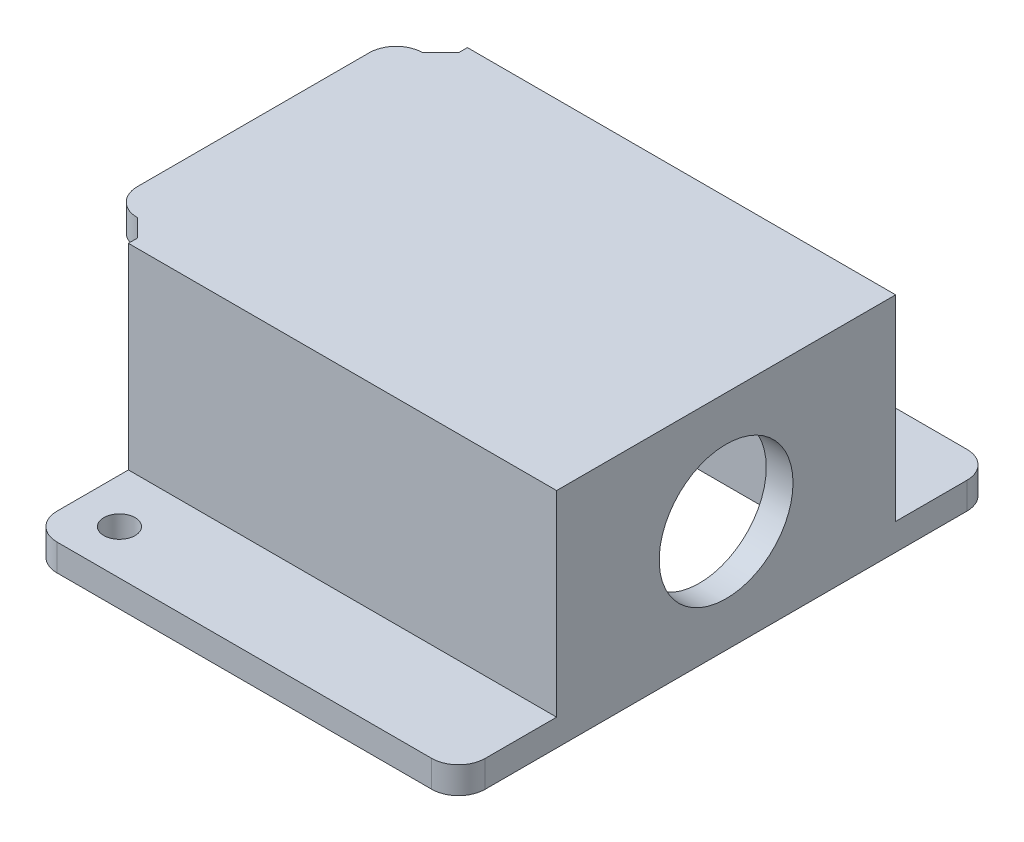
ISO-10303-21;
HEADER;
FILE_DESCRIPTION(('STEP AP214'),'2;1');
FILE_NAME('part.step','',(''),(''),'','','');
FILE_SCHEMA(('AUTOMOTIVE_DESIGN { 1 0 10303 214 1 1 1 1 }'));
ENDSEC;
DATA;
#1=APPLICATION_CONTEXT('core data for automotive mechanical design processes');
#2=APPLICATION_PROTOCOL_DEFINITION('international standard','automotive_design',2000,#1);
#3=PRODUCT_CONTEXT('',#1,'mechanical');
#4=PRODUCT('Part','Part','',(#3));
#5=PRODUCT_RELATED_PRODUCT_CATEGORY('part','',(#4));
#6=PRODUCT_DEFINITION_FORMATION('','',#4);
#7=PRODUCT_DEFINITION_CONTEXT('part definition',#1,'design');
#8=PRODUCT_DEFINITION('design','',#6,#7);
#9=PRODUCT_DEFINITION_SHAPE('','',#8);
#10=(LENGTH_UNIT() NAMED_UNIT(*) SI_UNIT(.MILLI.,.METRE.));
#11=(NAMED_UNIT(*) PLANE_ANGLE_UNIT() SI_UNIT($,.RADIAN.));
#12=(NAMED_UNIT(*) SI_UNIT($,.STERADIAN.) SOLID_ANGLE_UNIT());
#13=UNCERTAINTY_MEASURE_WITH_UNIT(LENGTH_MEASURE(1.E-05),#10,'distance_accuracy_value','');
#14=(GEOMETRIC_REPRESENTATION_CONTEXT(3) GLOBAL_UNCERTAINTY_ASSIGNED_CONTEXT((#13)) GLOBAL_UNIT_ASSIGNED_CONTEXT((#10,
#11,#12)) REPRESENTATION_CONTEXT('',''));
#15=CARTESIAN_POINT('',(0.,0.,0.));
#16=DIRECTION('',(0.,0.,1.));
#17=DIRECTION('',(1.,0.,0.));
#18=AXIS2_PLACEMENT_3D('',#15,#16,#17);
#19=CARTESIAN_POINT('',(5.,0.,0.));
#20=DIRECTION('',(-1.,0.,0.));
#21=DIRECTION('',(0.,0.,1.));
#22=AXIS2_PLACEMENT_3D('',#19,#20,#21);
#23=PLANE('',#22);
#24=DIRECTION('',(0.,0.,-1.));
#25=VECTOR('',#24,1.);
#26=CARTESIAN_POINT('',(5.,22.,0.));
#27=LINE('',#26,#25);
#28=CARTESIAN_POINT('',(5.,22.,-46.));
#29=VERTEX_POINT('',#28);
#30=CARTESIAN_POINT('',(5.,22.,-48.));
#31=VERTEX_POINT('',#30);
#32=EDGE_CURVE('E64',#29,#31,#27,.T.);
#33=ORIENTED_EDGE('',*,*,#32,.T.);
#34=DIRECTION('',(0.,1.,0.));
#35=VECTOR('',#34,1.);
#36=CARTESIAN_POINT('',(5.,0.,-48.));
#37=LINE('',#36,#35);
#38=CARTESIAN_POINT('',(5.,25.,-48.));
#39=VERTEX_POINT('',#38);
#40=EDGE_CURVE('E412',#31,#39,#37,.T.);
#41=ORIENTED_EDGE('',*,*,#40,.T.);
#42=DIRECTION('',(0.,0.,-1.));
#43=VECTOR('',#42,1.);
#44=CARTESIAN_POINT('',(5.,25.,-46.));
#45=LINE('',#44,#43);
#46=CARTESIAN_POINT('',(5.,25.,-49.));
#47=VERTEX_POINT('',#46);
#48=EDGE_CURVE('E236',#39,#47,#45,.T.);
#49=ORIENTED_EDGE('',*,*,#48,.T.);
#50=DIRECTION('',(0.,-1.,0.));
#51=VECTOR('',#50,1.);
#52=CARTESIAN_POINT('',(5.,25.,-49.));
#53=LINE('',#52,#51);
#54=CARTESIAN_POINT('',(5.,3.,-49.));
#55=VERTEX_POINT('',#54);
#56=EDGE_CURVE('E240',#47,#55,#53,.T.);
#57=ORIENTED_EDGE('',*,*,#56,.T.);
#58=DIRECTION('',(0.,0.,-1.));
#59=VECTOR('',#58,1.);
#60=CARTESIAN_POINT('',(5.,3.,-49.));
#61=LINE('',#60,#59);
#62=CARTESIAN_POINT('',(5.,3.,-57.));
#63=VERTEX_POINT('',#62);
#64=EDGE_CURVE('E243',#55,#63,#61,.T.);
#65=ORIENTED_EDGE('',*,*,#64,.T.);
#66=DIRECTION('',(0.,-1.,0.));
#67=VECTOR('',#66,1.);
#68=CARTESIAN_POINT('',(5.,0.,-57.));
#69=LINE('',#68,#67);
#70=CARTESIAN_POINT('',(5.,0.,-57.));
#71=VERTEX_POINT('',#70);
#72=EDGE_CURVE('E358',#63,#71,#69,.T.);
#73=ORIENTED_EDGE('',*,*,#72,.T.);
#74=DIRECTION('',(0.,0.,1.));
#75=VECTOR('',#74,1.);
#76=CARTESIAN_POINT('',(5.,0.,-60.));
#77=LINE('',#76,#75);
#78=CARTESIAN_POINT('',(5.,0.,-46.));
#79=VERTEX_POINT('',#78);
#80=EDGE_CURVE('E248',#71,#79,#77,.T.);
#81=ORIENTED_EDGE('',*,*,#80,.T.);
#82=DIRECTION('',(0.,1.,0.));
#83=VECTOR('',#82,1.);
#84=CARTESIAN_POINT('',(5.,25.,-46.));
#85=LINE('',#84,#83);
#86=EDGE_CURVE('E217',#79,#29,#85,.T.);
#87=ORIENTED_EDGE('',*,*,#86,.T.);
#88=EDGE_LOOP('',(#33,#41,#49,#57,#65,#73,#81,#87));
#89=FACE_BOUND('',#88,.T.);
#90=ADVANCED_FACE('F47',(#89),#23,.T.);
#91=CARTESIAN_POINT('',(50.,25.,-46.));
#92=DIRECTION('',(0.,0.,-1.));
#93=DIRECTION('',(-1.,0.,0.));
#94=AXIS2_PLACEMENT_3D('',#91,#92,#93);
#95=PLANE('',#94);
#96=ORIENTED_EDGE('',*,*,#86,.F.);
#97=DIRECTION('',(-1.,0.,0.));
#98=VECTOR('',#97,1.);
#99=CARTESIAN_POINT('',(50.,0.,-46.));
#100=LINE('',#99,#98);
#101=CARTESIAN_POINT('',(50.,0.,-46.));
#102=VERTEX_POINT('',#101);
#103=EDGE_CURVE('E215',#102,#79,#100,.T.);
#104=ORIENTED_EDGE('',*,*,#103,.F.);
#105=DIRECTION('',(0.,-1.,0.));
#106=VECTOR('',#105,1.);
#107=CARTESIAN_POINT('',(50.,25.,-46.));
#108=LINE('',#107,#106);
#109=CARTESIAN_POINT('',(50.,22.,-46.));
#110=VERTEX_POINT('',#109);
#111=EDGE_CURVE('E198',#110,#102,#108,.T.);
#112=ORIENTED_EDGE('',*,*,#111,.F.);
#113=DIRECTION('',(1.,0.,0.));
#114=VECTOR('',#113,1.);
#115=CARTESIAN_POINT('',(0.,22.,-46.));
#116=LINE('',#115,#114);
#117=EDGE_CURVE('E275',#29,#110,#116,.T.);
#118=ORIENTED_EDGE('',*,*,#117,.F.);
#119=EDGE_LOOP('',(#96,#104,#112,#118));
#120=FACE_BOUND('',#119,.T.);
#121=ADVANCED_FACE('F216',(#120),#95,.F.);
#122=CARTESIAN_POINT('',(0.,25.,-14.));
#123=DIRECTION('',(0.,0.,1.));
#124=DIRECTION('',(1.,0.,0.));
#125=AXIS2_PLACEMENT_3D('',#122,#123,#124);
#126=PLANE('',#125);
#127=DIRECTION('',(0.,-1.,0.));
#128=VECTOR('',#127,1.);
#129=CARTESIAN_POINT('',(5.,25.,-14.));
#130=LINE('',#129,#128);
#131=CARTESIAN_POINT('',(5.,22.,-14.));
#132=VERTEX_POINT('',#131);
#133=CARTESIAN_POINT('',(5.,0.,-14.));
#134=VERTEX_POINT('',#133);
#135=EDGE_CURVE('E261',#132,#134,#130,.T.);
#136=ORIENTED_EDGE('',*,*,#135,.F.);
#137=DIRECTION('',(1.,0.,0.));
#138=VECTOR('',#137,1.);
#139=CARTESIAN_POINT('',(0.,22.,-14.));
#140=LINE('',#139,#138);
#141=CARTESIAN_POINT('',(50.,22.,-14.));
#142=VERTEX_POINT('',#141);
#143=EDGE_CURVE('E270',#132,#142,#140,.T.);
#144=ORIENTED_EDGE('',*,*,#143,.T.);
#145=DIRECTION('',(0.,-1.,0.));
#146=VECTOR('',#145,1.);
#147=CARTESIAN_POINT('',(50.,25.,-14.));
#148=LINE('',#147,#146);
#149=CARTESIAN_POINT('',(50.,0.,-14.));
#150=VERTEX_POINT('',#149);
#151=EDGE_CURVE('E211',#142,#150,#148,.T.);
#152=ORIENTED_EDGE('',*,*,#151,.T.);
#153=DIRECTION('',(-1.,0.,0.));
#154=VECTOR('',#153,1.);
#155=CARTESIAN_POINT('',(50.,0.,-14.));
#156=LINE('',#155,#154);
#157=EDGE_CURVE('E221',#150,#134,#156,.T.);
#158=ORIENTED_EDGE('',*,*,#157,.T.);
#159=EDGE_LOOP('',(#136,#144,#152,#158));
#160=FACE_BOUND('',#159,.T.);
#161=ADVANCED_FACE('F535',(#160),#126,.F.);
#162=CARTESIAN_POINT('',(0.,3.,0.));
#163=DIRECTION('',(0.,-1.,0.));
#164=DIRECTION('',(0.,0.,-1.));
#165=AXIS2_PLACEMENT_3D('',#162,#163,#164);
#166=PLANE('',#165);
#167=CARTESIAN_POINT('',(10.,3.,-55.));
#168=DIRECTION('',(0.,-1.,0.));
#169=DIRECTION('',(0.,0.,-1.));
#170=AXIS2_PLACEMENT_3D('',#167,#168,#169);
#171=CIRCLE('',#170,1.75);
#172=CARTESIAN_POINT('',(10.,3.00000000000001,-56.75));
#173=VERTEX_POINT('',#172);
#174=EDGE_CURVE('E577',#173,#173,#171,.T.);
#175=ORIENTED_EDGE('',*,*,#174,.T.);
#176=EDGE_LOOP('',(#175));
#177=FACE_BOUND('',#176,.T.);
#178=DIRECTION('',(-1.,0.,0.));
#179=VECTOR('',#178,1.);
#180=CARTESIAN_POINT('',(0.,3.,-60.));
#181=LINE('',#180,#179);
#182=CARTESIAN_POINT('',(50.,3.,-60.));
#183=VERTEX_POINT('',#182);
#184=CARTESIAN_POINT('',(8.,3.,-60.));
#185=VERTEX_POINT('',#184);
#186=EDGE_CURVE('E319',#183,#185,#181,.T.);
#187=ORIENTED_EDGE('',*,*,#186,.T.);
#188=CARTESIAN_POINT('',(8.,3.,-57.));
#189=DIRECTION('',(0.,-1.,0.));
#190=DIRECTION('',(0.,0.,-1.));
#191=AXIS2_PLACEMENT_3D('',#188,#189,#190);
#192=CIRCLE('',#191,3.);
#193=EDGE_CURVE('E384',#185,#63,#192,.F.);
#194=ORIENTED_EDGE('',*,*,#193,.T.);
#195=ORIENTED_EDGE('',*,*,#64,.F.);
#196=DIRECTION('',(-1.,0.,0.));
#197=VECTOR('',#196,1.);
#198=CARTESIAN_POINT('',(0.,3.,-49.));
#199=LINE('',#198,#197);
#200=CARTESIAN_POINT('',(53.,3.,-49.));
#201=VERTEX_POINT('',#200);
#202=EDGE_CURVE('E284',#201,#55,#199,.T.);
#203=ORIENTED_EDGE('',*,*,#202,.F.);
#204=DIRECTION('',(0.,0.,-1.));
#205=VECTOR('',#204,1.);
#206=CARTESIAN_POINT('',(53.,3.,0.));
#207=LINE('',#206,#205);
#208=CARTESIAN_POINT('',(53.,3.,-57.));
#209=VERTEX_POINT('',#208);
#210=EDGE_CURVE('E314',#201,#209,#207,.T.);
#211=ORIENTED_EDGE('',*,*,#210,.T.);
#212=CARTESIAN_POINT('',(50.,3.,-57.));
#213=DIRECTION('',(0.,-1.,0.));
#214=DIRECTION('',(0.,0.,-1.));
#215=AXIS2_PLACEMENT_3D('',#212,#213,#214);
#216=CIRCLE('',#215,3.);
#217=EDGE_CURVE('E381',#209,#183,#216,.F.);
#218=ORIENTED_EDGE('',*,*,#217,.T.);
#219=EDGE_LOOP('',(#187,#194,#195,#203,#211,#218));
#220=FACE_BOUND('',#219,.T.);
#221=ADVANCED_FACE('F480',(#177,#220),#166,.F.);
#222=CARTESIAN_POINT('',(10.,3.,-5.));
#223=DIRECTION('',(0.,-1.,0.));
#224=DIRECTION('',(0.,0.,-1.));
#225=AXIS2_PLACEMENT_3D('',#222,#223,#224);
#226=CIRCLE('',#225,1.75);
#227=CARTESIAN_POINT('',(10.,3.00000000000001,-6.75));
#228=VERTEX_POINT('',#227);
#229=EDGE_CURVE('E574',#228,#228,#226,.T.);
#230=ORIENTED_EDGE('',*,*,#229,.T.);
#231=EDGE_LOOP('',(#230));
#232=FACE_BOUND('',#231,.T.);
#233=DIRECTION('',(1.,0.,0.));
#234=VECTOR('',#233,1.);
#235=CARTESIAN_POINT('',(0.,3.,0.));
#236=LINE('',#235,#234);
#237=CARTESIAN_POINT('',(8.,3.,0.));
#238=VERTEX_POINT('',#237);
#239=CARTESIAN_POINT('',(50.,3.,0.));
#240=VERTEX_POINT('',#239);
#241=EDGE_CURVE('E310',#238,#240,#236,.T.);
#242=ORIENTED_EDGE('',*,*,#241,.T.);
#243=CARTESIAN_POINT('',(50.,3.,-3.));
#244=DIRECTION('',(0.,-1.,0.));
#245=DIRECTION('',(0.,0.,-1.));
#246=AXIS2_PLACEMENT_3D('',#243,#244,#245);
#247=CIRCLE('',#246,3.);
#248=CARTESIAN_POINT('',(53.,3.,-3.));
#249=VERTEX_POINT('',#248);
#250=EDGE_CURVE('E403',#240,#249,#247,.F.);
#251=ORIENTED_EDGE('',*,*,#250,.T.);
#252=CARTESIAN_POINT('',(53.,3.,-11.));
#253=VERTEX_POINT('',#252);
#254=EDGE_CURVE('E316',#249,#253,#207,.T.);
#255=ORIENTED_EDGE('',*,*,#254,.T.);
#256=DIRECTION('',(1.,0.,0.));
#257=VECTOR('',#256,1.);
#258=CARTESIAN_POINT('',(53.,3.,-11.));
#259=LINE('',#258,#257);
#260=CARTESIAN_POINT('',(5.,3.,-11.));
#261=VERTEX_POINT('',#260);
#262=EDGE_CURVE('E278',#261,#253,#259,.T.);
#263=ORIENTED_EDGE('',*,*,#262,.F.);
#264=DIRECTION('',(0.,0.,-1.));
#265=VECTOR('',#264,1.);
#266=CARTESIAN_POINT('',(5.,3.,0.));
#267=LINE('',#266,#265);
#268=CARTESIAN_POINT('',(5.,3.,-3.));
#269=VERTEX_POINT('',#268);
#270=EDGE_CURVE('E251',#269,#261,#267,.T.);
#271=ORIENTED_EDGE('',*,*,#270,.F.);
#272=CARTESIAN_POINT('',(8.,3.,-3.));
#273=DIRECTION('',(0.,-1.,0.));
#274=DIRECTION('',(0.,0.,-1.));
#275=AXIS2_PLACEMENT_3D('',#272,#273,#274);
#276=CIRCLE('',#275,3.);
#277=EDGE_CURVE('E400',#269,#238,#276,.F.);
#278=ORIENTED_EDGE('',*,*,#277,.T.);
#279=EDGE_LOOP('',(#242,#251,#255,#263,#271,#278));
#280=FACE_BOUND('',#279,.T.);
#281=ADVANCED_FACE('F452',(#232,#280),#166,.F.);
#282=CARTESIAN_POINT('',(0.,3.,0.));
#283=DIRECTION('',(0.,0.,-1.));
#284=DIRECTION('',(-1.,0.,0.));
#285=AXIS2_PLACEMENT_3D('',#282,#283,#284);
#286=PLANE('',#285);
#287=DIRECTION('',(1.,0.,0.));
#288=VECTOR('',#287,1.);
#289=CARTESIAN_POINT('',(0.,0.,0.));
#290=LINE('',#289,#288);
#291=CARTESIAN_POINT('',(8.,0.,0.));
#292=VERTEX_POINT('',#291);
#293=CARTESIAN_POINT('',(50.,0.,0.));
#294=VERTEX_POINT('',#293);
#295=EDGE_CURVE('E210',#292,#294,#290,.T.);
#296=ORIENTED_EDGE('',*,*,#295,.T.);
#297=DIRECTION('',(0.,-1.,0.));
#298=VECTOR('',#297,1.);
#299=CARTESIAN_POINT('',(50.,3.,0.));
#300=LINE('',#299,#298);
#301=EDGE_CURVE('E397',#294,#240,#300,.F.);
#302=ORIENTED_EDGE('',*,*,#301,.T.);
#303=ORIENTED_EDGE('',*,*,#241,.F.);
#304=DIRECTION('',(0.,1.,0.));
#305=VECTOR('',#304,1.);
#306=CARTESIAN_POINT('',(8.,0.,0.));
#307=LINE('',#306,#305);
#308=EDGE_CURVE('E394',#238,#292,#307,.F.);
#309=ORIENTED_EDGE('',*,*,#308,.T.);
#310=EDGE_LOOP('',(#296,#302,#303,#309));
#311=FACE_BOUND('',#310,.T.);
#312=ADVANCED_FACE('F466',(#311),#286,.F.);
#313=CARTESIAN_POINT('',(0.,3.,-60.));
#314=DIRECTION('',(0.,0.,1.));
#315=DIRECTION('',(1.,0.,0.));
#316=AXIS2_PLACEMENT_3D('',#313,#314,#315);
#317=PLANE('',#316);
#318=DIRECTION('',(-1.,0.,0.));
#319=VECTOR('',#318,1.);
#320=CARTESIAN_POINT('',(0.,0.,-60.));
#321=LINE('',#320,#319);
#322=CARTESIAN_POINT('',(50.,0.,-60.));
#323=VERTEX_POINT('',#322);
#324=CARTESIAN_POINT('',(8.,0.,-60.));
#325=VERTEX_POINT('',#324);
#326=EDGE_CURVE('E315',#323,#325,#321,.T.);
#327=ORIENTED_EDGE('',*,*,#326,.T.);
#328=DIRECTION('',(0.,-1.,0.));
#329=VECTOR('',#328,1.);
#330=CARTESIAN_POINT('',(8.,3.,-60.));
#331=LINE('',#330,#329);
#332=EDGE_CURVE('E378',#325,#185,#331,.F.);
#333=ORIENTED_EDGE('',*,*,#332,.T.);
#334=ORIENTED_EDGE('',*,*,#186,.F.);
#335=DIRECTION('',(0.,-1.,0.));
#336=VECTOR('',#335,1.);
#337=CARTESIAN_POINT('',(50.,3.,-60.));
#338=LINE('',#337,#336);
#339=EDGE_CURVE('E374',#183,#323,#338,.T.);
#340=ORIENTED_EDGE('',*,*,#339,.T.);
#341=EDGE_LOOP('',(#327,#333,#334,#340));
#342=FACE_BOUND('',#341,.T.);
#343=ADVANCED_FACE('F490',(#342),#317,.F.);
#344=CARTESIAN_POINT('',(0.,0.,0.));
#345=DIRECTION('',(0.,-1.,0.));
#346=DIRECTION('',(0.,0.,-1.));
#347=AXIS2_PLACEMENT_3D('',#344,#345,#346);
#348=PLANE('',#347);
#349=CARTESIAN_POINT('',(10.,0.,-5.));
#350=DIRECTION('',(0.,-1.,0.));
#351=DIRECTION('',(0.,0.,-1.));
#352=AXIS2_PLACEMENT_3D('',#349,#350,#351);
#353=CIRCLE('',#352,1.75);
#354=CARTESIAN_POINT('',(10.,0.,-6.75));
#355=VERTEX_POINT('',#354);
#356=EDGE_CURVE('E583',#355,#355,#353,.T.);
#357=ORIENTED_EDGE('',*,*,#356,.F.);
#358=EDGE_LOOP('',(#357));
#359=FACE_BOUND('',#358,.T.);
#360=CARTESIAN_POINT('',(10.,0.,-55.));
#361=DIRECTION('',(0.,-1.,0.));
#362=DIRECTION('',(0.,0.,-1.));
#363=AXIS2_PLACEMENT_3D('',#360,#361,#362);
#364=CIRCLE('',#363,1.75);
#365=CARTESIAN_POINT('',(10.,0.,-56.75));
#366=VERTEX_POINT('',#365);
#367=EDGE_CURVE('E586',#366,#366,#364,.T.);
#368=ORIENTED_EDGE('',*,*,#367,.F.);
#369=EDGE_LOOP('',(#368));
#370=FACE_BOUND('',#369,.T.);
#371=ORIENTED_EDGE('',*,*,#80,.F.);
#372=CARTESIAN_POINT('',(8.,0.,-57.));
#373=DIRECTION('',(0.,-1.,0.));
#374=DIRECTION('',(0.,0.,-1.));
#375=AXIS2_PLACEMENT_3D('',#372,#373,#374);
#376=CIRCLE('',#375,3.);
#377=EDGE_CURVE('E371',#71,#325,#376,.T.);
#378=ORIENTED_EDGE('',*,*,#377,.T.);
#379=ORIENTED_EDGE('',*,*,#326,.F.);
#380=CARTESIAN_POINT('',(50.,0.,-57.));
#381=DIRECTION('',(0.,-1.,0.));
#382=DIRECTION('',(0.,0.,-1.));
#383=AXIS2_PLACEMENT_3D('',#380,#381,#382);
#384=CIRCLE('',#383,3.);
#385=CARTESIAN_POINT('',(53.,0.,-57.));
#386=VERTEX_POINT('',#385);
#387=EDGE_CURVE('E368',#323,#386,#384,.T.);
#388=ORIENTED_EDGE('',*,*,#387,.T.);
#389=DIRECTION('',(0.,0.,-1.));
#390=VECTOR('',#389,1.);
#391=CARTESIAN_POINT('',(53.,0.,0.));
#392=LINE('',#391,#390);
#393=CARTESIAN_POINT('',(53.,0.,-3.));
#394=VERTEX_POINT('',#393);
#395=EDGE_CURVE('E327',#394,#386,#392,.T.);
#396=ORIENTED_EDGE('',*,*,#395,.F.);
#397=CARTESIAN_POINT('',(50.,0.,-3.));
#398=DIRECTION('',(0.,-1.,0.));
#399=DIRECTION('',(0.,0.,-1.));
#400=AXIS2_PLACEMENT_3D('',#397,#398,#399);
#401=CIRCLE('',#400,3.);
#402=EDGE_CURVE('E365',#394,#294,#401,.T.);
#403=ORIENTED_EDGE('',*,*,#402,.T.);
#404=ORIENTED_EDGE('',*,*,#295,.F.);
#405=CARTESIAN_POINT('',(8.,0.,-3.));
#406=DIRECTION('',(0.,-1.,0.));
#407=DIRECTION('',(0.,0.,-1.));
#408=AXIS2_PLACEMENT_3D('',#405,#406,#407);
#409=CIRCLE('',#408,3.);
#410=CARTESIAN_POINT('',(5.,0.,-3.00000000000002));
#411=VERTEX_POINT('',#410);
#412=EDGE_CURVE('E362',#292,#411,#409,.T.);
#413=ORIENTED_EDGE('',*,*,#412,.T.);
#414=EDGE_CURVE('E247',#134,#411,#77,.T.);
#415=ORIENTED_EDGE('',*,*,#414,.F.);
#416=ORIENTED_EDGE('',*,*,#157,.F.);
#417=DIRECTION('',(0.,0.,1.));
#418=VECTOR('',#417,1.);
#419=CARTESIAN_POINT('',(50.,0.,-46.));
#420=LINE('',#419,#418);
#421=EDGE_CURVE('E203',#102,#150,#420,.T.);
#422=ORIENTED_EDGE('',*,*,#421,.F.);
#423=ORIENTED_EDGE('',*,*,#103,.T.);
#424=EDGE_LOOP('',(#371,#378,#379,#388,#396,#403,#404,#413,#415,#416,#422,#423));
#425=FACE_BOUND('',#424,.T.);
#426=ADVANCED_FACE('F223',(#359,#370,#425),#348,.T.);
#427=CARTESIAN_POINT('',(53.,25.,-11.));
#428=DIRECTION('',(0.,0.,-1.));
#429=DIRECTION('',(-1.,0.,0.));
#430=AXIS2_PLACEMENT_3D('',#427,#428,#429);
#431=PLANE('',#430);
#432=DIRECTION('',(0.,1.,0.));
#433=VECTOR('',#432,1.);
#434=CARTESIAN_POINT('',(5.,3.,-11.));
#435=LINE('',#434,#433);
#436=CARTESIAN_POINT('',(5.,25.,-11.));
#437=VERTEX_POINT('',#436);
#438=EDGE_CURVE('E254',#261,#437,#435,.T.);
#439=ORIENTED_EDGE('',*,*,#438,.F.);
#440=ORIENTED_EDGE('',*,*,#262,.T.);
#441=DIRECTION('',(0.,-1.,0.));
#442=VECTOR('',#441,1.);
#443=CARTESIAN_POINT('',(53.,25.,-11.));
#444=LINE('',#443,#442);
#445=CARTESIAN_POINT('',(53.,25.,-11.));
#446=VERTEX_POINT('',#445);
#447=EDGE_CURVE('E304',#446,#253,#444,.T.);
#448=ORIENTED_EDGE('',*,*,#447,.F.);
#449=DIRECTION('',(1.,0.,0.));
#450=VECTOR('',#449,1.);
#451=CARTESIAN_POINT('',(53.,25.,-11.));
#452=LINE('',#451,#450);
#453=EDGE_CURVE('E283',#437,#446,#452,.T.);
#454=ORIENTED_EDGE('',*,*,#453,.F.);
#455=EDGE_LOOP('',(#439,#440,#448,#454));
#456=FACE_BOUND('',#455,.T.);
#457=ADVANCED_FACE('F449',(#456),#431,.F.);
#458=CARTESIAN_POINT('',(0.,25.,-49.));
#459=DIRECTION('',(0.,0.,1.));
#460=DIRECTION('',(1.,0.,0.));
#461=AXIS2_PLACEMENT_3D('',#458,#459,#460);
#462=PLANE('',#461);
#463=ORIENTED_EDGE('',*,*,#56,.F.);
#464=DIRECTION('',(-1.,0.,0.));
#465=VECTOR('',#464,1.);
#466=CARTESIAN_POINT('',(0.,25.,-49.));
#467=LINE('',#466,#465);
#468=CARTESIAN_POINT('',(53.,25.,-49.));
#469=VERTEX_POINT('',#468);
#470=EDGE_CURVE('E290',#469,#47,#467,.T.);
#471=ORIENTED_EDGE('',*,*,#470,.F.);
#472=DIRECTION('',(0.,-1.,0.));
#473=VECTOR('',#472,1.);
#474=CARTESIAN_POINT('',(53.,25.,-49.));
#475=LINE('',#474,#473);
#476=EDGE_CURVE('E294',#469,#201,#475,.T.);
#477=ORIENTED_EDGE('',*,*,#476,.T.);
#478=ORIENTED_EDGE('',*,*,#202,.T.);
#479=EDGE_LOOP('',(#463,#471,#477,#478));
#480=FACE_BOUND('',#479,.T.);
#481=ADVANCED_FACE('F499',(#480),#462,.F.);
#482=CARTESIAN_POINT('',(50.,25.,-14.));
#483=DIRECTION('',(1.,0.,0.));
#484=DIRECTION('',(0.,0.,-1.));
#485=AXIS2_PLACEMENT_3D('',#482,#483,#484);
#486=PLANE('',#485);
#487=CARTESIAN_POINT('',(50.,12.5,-30.));
#488=DIRECTION('',(1.,0.,0.));
#489=DIRECTION('',(0.,0.,-1.));
#490=AXIS2_PLACEMENT_3D('',#487,#488,#489);
#491=CIRCLE('',#490,7.49999999999999);
#492=CARTESIAN_POINT('',(50.,12.5,-37.5));
#493=VERTEX_POINT('',#492);
#494=EDGE_CURVE('E227',#493,#493,#491,.T.);
#495=ORIENTED_EDGE('',*,*,#494,.T.);
#496=EDGE_LOOP('',(#495));
#497=FACE_BOUND('',#496,.T.);
#498=DIRECTION('',(0.,0.,1.));
#499=VECTOR('',#498,1.);
#500=CARTESIAN_POINT('',(50.,22.,-46.));
#501=LINE('',#500,#499);
#502=EDGE_CURVE('E206',#110,#142,#501,.T.);
#503=ORIENTED_EDGE('',*,*,#502,.F.);
#504=ORIENTED_EDGE('',*,*,#111,.T.);
#505=ORIENTED_EDGE('',*,*,#421,.T.);
#506=ORIENTED_EDGE('',*,*,#151,.F.);
#507=EDGE_LOOP('',(#503,#504,#505,#506));
#508=FACE_BOUND('',#507,.T.);
#509=ADVANCED_FACE('F200',(#497,#508),#486,.F.);
#510=CARTESIAN_POINT('',(0.,3.,0.));
#511=DIRECTION('',(1.,0.,0.));
#512=DIRECTION('',(0.,0.,-1.));
#513=AXIS2_PLACEMENT_3D('',#510,#511,#512);
#514=PLANE('',#513);
#515=DIRECTION('',(0.,0.,1.));
#516=VECTOR('',#515,1.);
#517=CARTESIAN_POINT('',(0.,22.,-46.));
#518=LINE('',#517,#516);
#519=CARTESIAN_POINT('',(0.,22.,-43.));
#520=VERTEX_POINT('',#519);
#521=CARTESIAN_POINT('',(0.,22.,-17.));
#522=VERTEX_POINT('',#521);
#523=EDGE_CURVE('E266',#520,#522,#518,.T.);
#524=ORIENTED_EDGE('',*,*,#523,.T.);
#525=DIRECTION('',(0.,-1.,0.));
#526=VECTOR('',#525,1.);
#527=CARTESIAN_POINT('',(0.,3.,-17.));
#528=LINE('',#527,#526);
#529=CARTESIAN_POINT('',(0.,25.,-17.));
#530=VERTEX_POINT('',#529);
#531=EDGE_CURVE('E345',#522,#530,#528,.F.);
#532=ORIENTED_EDGE('',*,*,#531,.T.);
#533=DIRECTION('',(0.,0.,1.));
#534=VECTOR('',#533,1.);
#535=CARTESIAN_POINT('',(0.,25.,-46.));
#536=LINE('',#535,#534);
#537=CARTESIAN_POINT('',(0.,25.,-43.));
#538=VERTEX_POINT('',#537);
#539=EDGE_CURVE('E279',#538,#530,#536,.T.);
#540=ORIENTED_EDGE('',*,*,#539,.F.);
#541=DIRECTION('',(0.,1.,0.));
#542=VECTOR('',#541,1.);
#543=CARTESIAN_POINT('',(0.,3.,-43.));
#544=LINE('',#543,#542);
#545=EDGE_CURVE('E342',#538,#520,#544,.F.);
#546=ORIENTED_EDGE('',*,*,#545,.T.);
#547=EDGE_LOOP('',(#524,#532,#540,#546));
#548=FACE_BOUND('',#547,.T.);
#549=ADVANCED_FACE('F514',(#548),#514,.F.);
#550=CARTESIAN_POINT('',(53.,3.,0.));
#551=DIRECTION('',(-1.,0.,0.));
#552=DIRECTION('',(0.,0.,1.));
#553=AXIS2_PLACEMENT_3D('',#550,#551,#552);
#554=PLANE('',#553);
#555=CARTESIAN_POINT('',(53.,12.5,-30.));
#556=DIRECTION('',(1.,0.,0.));
#557=DIRECTION('',(0.,0.,-1.));
#558=AXIS2_PLACEMENT_3D('',#555,#556,#557);
#559=CIRCLE('',#558,7.49999999999999);
#560=CARTESIAN_POINT('',(53.,12.5,-37.5));
#561=VERTEX_POINT('',#560);
#562=EDGE_CURVE('E231',#561,#561,#559,.T.);
#563=ORIENTED_EDGE('',*,*,#562,.F.);
#564=EDGE_LOOP('',(#563));
#565=FACE_BOUND('',#564,.T.);
#566=ORIENTED_EDGE('',*,*,#395,.T.);
#567=DIRECTION('',(0.,-1.,0.));
#568=VECTOR('',#567,1.);
#569=CARTESIAN_POINT('',(53.,3.,-57.));
#570=LINE('',#569,#568);
#571=EDGE_CURVE('E391',#386,#209,#570,.F.);
#572=ORIENTED_EDGE('',*,*,#571,.T.);
#573=ORIENTED_EDGE('',*,*,#210,.F.);
#574=ORIENTED_EDGE('',*,*,#476,.F.);
#575=DIRECTION('',(0.,0.,-1.));
#576=VECTOR('',#575,1.);
#577=CARTESIAN_POINT('',(53.,25.,-49.));
#578=LINE('',#577,#576);
#579=EDGE_CURVE('E287',#446,#469,#578,.T.);
#580=ORIENTED_EDGE('',*,*,#579,.F.);
#581=ORIENTED_EDGE('',*,*,#447,.T.);
#582=ORIENTED_EDGE('',*,*,#254,.F.);
#583=DIRECTION('',(0.,-1.,0.));
#584=VECTOR('',#583,1.);
#585=CARTESIAN_POINT('',(53.,3.,-3.));
#586=LINE('',#585,#584);
#587=EDGE_CURVE('E387',#249,#394,#586,.T.);
#588=ORIENTED_EDGE('',*,*,#587,.T.);
#589=EDGE_LOOP('',(#566,#572,#573,#574,#580,#581,#582,#588));
#590=FACE_BOUND('',#589,.T.);
#591=ADVANCED_FACE('F457',(#565,#590),#554,.F.);
#592=CARTESIAN_POINT('',(0.,25.,0.));
#593=DIRECTION('',(0.,-1.,0.));
#594=DIRECTION('',(0.,0.,-1.));
#595=AXIS2_PLACEMENT_3D('',#592,#593,#594);
#596=PLANE('',#595);
#597=ORIENTED_EDGE('',*,*,#539,.T.);
#598=CARTESIAN_POINT('',(3.,25.,-17.));
#599=DIRECTION('',(0.,-1.,0.));
#600=DIRECTION('',(0.,0.,-1.));
#601=AXIS2_PLACEMENT_3D('',#598,#599,#600);
#602=CIRCLE('',#601,3.);
#603=CARTESIAN_POINT('',(3.,25.,-14.));
#604=VERTEX_POINT('',#603);
#605=EDGE_CURVE('E351',#530,#604,#602,.F.);
#606=ORIENTED_EDGE('',*,*,#605,.T.);
#607=DIRECTION('',(0.707106781186544,0.,0.707106781186551));
#608=VECTOR('',#607,1.);
#609=CARTESIAN_POINT('',(8.50000000000002,25.,-8.49999999999993));
#610=LINE('',#609,#608);
#611=CARTESIAN_POINT('',(5.,25.,-12.));
#612=VERTEX_POINT('',#611);
#613=EDGE_CURVE('E11',#604,#612,#610,.T.);
#614=ORIENTED_EDGE('',*,*,#613,.T.);
#615=DIRECTION('',(0.,0.,-1.));
#616=VECTOR('',#615,1.);
#617=CARTESIAN_POINT('',(5.,25.,-11.));
#618=LINE('',#617,#616);
#619=EDGE_CURVE('E257',#437,#612,#618,.T.);
#620=ORIENTED_EDGE('',*,*,#619,.F.);
#621=ORIENTED_EDGE('',*,*,#453,.T.);
#622=ORIENTED_EDGE('',*,*,#579,.T.);
#623=ORIENTED_EDGE('',*,*,#470,.T.);
#624=ORIENTED_EDGE('',*,*,#48,.F.);
#625=DIRECTION('',(-0.707106781186543,0.,0.707106781186552));
#626=VECTOR('',#625,1.);
#627=CARTESIAN_POINT('',(-21.5,25.,-21.4999999999997));
#628=LINE('',#627,#626);
#629=CARTESIAN_POINT('',(3.,25.,-46.));
#630=VERTEX_POINT('',#629);
#631=EDGE_CURVE('E423',#39,#630,#628,.T.);
#632=ORIENTED_EDGE('',*,*,#631,.T.);
#633=CARTESIAN_POINT('',(3.,25.,-43.));
#634=DIRECTION('',(0.,-1.,0.));
#635=DIRECTION('',(0.,0.,-1.));
#636=AXIS2_PLACEMENT_3D('',#633,#634,#635);
#637=CIRCLE('',#636,3.);
#638=EDGE_CURVE('E348',#630,#538,#637,.F.);
#639=ORIENTED_EDGE('',*,*,#638,.T.);
#640=EDGE_LOOP('',(#597,#606,#614,#620,#621,#622,#623,#624,#632,#639));
#641=FACE_BOUND('',#640,.T.);
#642=ADVANCED_FACE('F441',(#641),#596,.F.);
#643=CARTESIAN_POINT('',(0.,22.,-46.));
#644=DIRECTION('',(0.,1.,0.));
#645=DIRECTION('',(0.,0.,1.));
#646=AXIS2_PLACEMENT_3D('',#643,#644,#645);
#647=PLANE('',#646);
#648=ORIENTED_EDGE('',*,*,#143,.F.);
#649=DIRECTION('',(0.,0.,-1.));
#650=VECTOR('',#649,1.);
#651=CARTESIAN_POINT('',(5.,22.,0.));
#652=LINE('',#651,#650);
#653=CARTESIAN_POINT('',(5.,22.,-12.));
#654=VERTEX_POINT('',#653);
#655=EDGE_CURVE('E416',#654,#132,#652,.T.);
#656=ORIENTED_EDGE('',*,*,#655,.F.);
#657=DIRECTION('',(-0.707106781186544,0.,-0.707106781186551));
#658=VECTOR('',#657,1.);
#659=CARTESIAN_POINT('',(-14.5,22.,-31.5000000000002));
#660=LINE('',#659,#658);
#661=CARTESIAN_POINT('',(3.,22.,-14.));
#662=VERTEX_POINT('',#661);
#663=EDGE_CURVE('E57',#654,#662,#660,.T.);
#664=ORIENTED_EDGE('',*,*,#663,.T.);
#665=CARTESIAN_POINT('',(3.,22.,-17.));
#666=DIRECTION('',(0.,1.,0.));
#667=DIRECTION('',(0.,0.,1.));
#668=AXIS2_PLACEMENT_3D('',#665,#666,#667);
#669=CIRCLE('',#668,3.);
#670=EDGE_CURVE('E339',#662,#522,#669,.F.);
#671=ORIENTED_EDGE('',*,*,#670,.T.);
#672=ORIENTED_EDGE('',*,*,#523,.F.);
#673=CARTESIAN_POINT('',(3.,22.,-43.));
#674=DIRECTION('',(0.,1.,0.));
#675=DIRECTION('',(0.,0.,1.));
#676=AXIS2_PLACEMENT_3D('',#673,#674,#675);
#677=CIRCLE('',#676,3.);
#678=CARTESIAN_POINT('',(3.,22.,-46.));
#679=VERTEX_POINT('',#678);
#680=EDGE_CURVE('E336',#520,#679,#677,.F.);
#681=ORIENTED_EDGE('',*,*,#680,.T.);
#682=DIRECTION('',(0.707106781186543,0.,-0.707106781186552));
#683=VECTOR('',#682,1.);
#684=CARTESIAN_POINT('',(1.50000000000003,22.,-44.5));
#685=LINE('',#684,#683);
#686=EDGE_CURVE('E426',#679,#31,#685,.T.);
#687=ORIENTED_EDGE('',*,*,#686,.T.);
#688=ORIENTED_EDGE('',*,*,#32,.F.);
#689=ORIENTED_EDGE('',*,*,#117,.T.);
#690=ORIENTED_EDGE('',*,*,#502,.T.);
#691=EDGE_LOOP('',(#648,#656,#664,#671,#672,#681,#687,#688,#689,#690));
#692=FACE_BOUND('',#691,.T.);
#693=ADVANCED_FACE('F431',(#692),#647,.F.);
#694=ORIENTED_EDGE('',*,*,#619,.T.);
#695=DIRECTION('',(0.,-1.,0.));
#696=VECTOR('',#695,1.);
#697=CARTESIAN_POINT('',(5.,0.,-12.));
#698=LINE('',#697,#696);
#699=EDGE_CURVE('E419',#612,#654,#698,.T.);
#700=ORIENTED_EDGE('',*,*,#699,.T.);
#701=ORIENTED_EDGE('',*,*,#655,.T.);
#702=ORIENTED_EDGE('',*,*,#135,.T.);
#703=ORIENTED_EDGE('',*,*,#414,.T.);
#704=DIRECTION('',(0.,1.,0.));
#705=VECTOR('',#704,1.);
#706=CARTESIAN_POINT('',(5.,3.,-3.));
#707=LINE('',#706,#705);
#708=EDGE_CURVE('E406',#411,#269,#707,.T.);
#709=ORIENTED_EDGE('',*,*,#708,.T.);
#710=ORIENTED_EDGE('',*,*,#270,.T.);
#711=ORIENTED_EDGE('',*,*,#438,.T.);
#712=EDGE_LOOP('',(#694,#700,#701,#702,#703,#709,#710,#711));
#713=FACE_BOUND('',#712,.T.);
#714=ADVANCED_FACE('F444',(#713),#23,.T.);
#715=CARTESIAN_POINT('',(8.,12.5,-30.));
#716=DIRECTION('',(1.,0.,0.));
#717=DIRECTION('',(0.,0.,-1.));
#718=AXIS2_PLACEMENT_3D('',#715,#716,#717);
#719=CYLINDRICAL_SURFACE('',#718,7.49999999999999);
#720=CARTESIAN_POINT('',(53.,12.5,-37.5));
#721=CARTESIAN_POINT('',(52.96875,12.5,-37.5));
#722=CARTESIAN_POINT('',(52.9375,12.5,-37.5));
#723=CARTESIAN_POINT('',(52.875,12.5,-37.5));
#724=CARTESIAN_POINT('',(52.84375,12.5,-37.5));
#725=CARTESIAN_POINT('',(52.78125,12.5,-37.5));
#726=CARTESIAN_POINT('',(52.75,12.5,-37.5));
#727=CARTESIAN_POINT('',(52.6875,12.5,-37.5));
#728=CARTESIAN_POINT('',(52.65625,12.5,-37.5));
#729=CARTESIAN_POINT('',(52.59375,12.5,-37.5));
#730=CARTESIAN_POINT('',(52.5625,12.5,-37.5));
#731=CARTESIAN_POINT('',(52.5,12.5,-37.5));
#732=CARTESIAN_POINT('',(52.46875,12.5,-37.5));
#733=CARTESIAN_POINT('',(52.40625,12.5,-37.5));
#734=CARTESIAN_POINT('',(52.375,12.5,-37.5));
#735=CARTESIAN_POINT('',(52.3125,12.5,-37.5));
#736=CARTESIAN_POINT('',(52.28125,12.5,-37.5));
#737=CARTESIAN_POINT('',(52.21875,12.5,-37.5));
#738=CARTESIAN_POINT('',(52.1875,12.5,-37.5));
#739=CARTESIAN_POINT('',(52.125,12.5,-37.5));
#740=CARTESIAN_POINT('',(52.09375,12.5,-37.5));
#741=CARTESIAN_POINT('',(52.03125,12.5,-37.5));
#742=CARTESIAN_POINT('',(52.,12.5,-37.5));
#743=CARTESIAN_POINT('',(51.9375,12.5,-37.5));
#744=CARTESIAN_POINT('',(51.90625,12.5,-37.5));
#745=CARTESIAN_POINT('',(51.84375,12.5,-37.5));
#746=CARTESIAN_POINT('',(51.8125,12.5,-37.5));
#747=CARTESIAN_POINT('',(51.75,12.5,-37.5));
#748=CARTESIAN_POINT('',(51.71875,12.5,-37.5));
#749=CARTESIAN_POINT('',(51.65625,12.5,-37.5));
#750=CARTESIAN_POINT('',(51.625,12.5,-37.5));
#751=CARTESIAN_POINT('',(51.5625,12.5,-37.5));
#752=CARTESIAN_POINT('',(51.53125,12.5,-37.5));
#753=CARTESIAN_POINT('',(51.46875,12.5,-37.5));
#754=CARTESIAN_POINT('',(51.4375,12.5,-37.5));
#755=CARTESIAN_POINT('',(51.375,12.5,-37.5));
#756=CARTESIAN_POINT('',(51.34375,12.5,-37.5));
#757=CARTESIAN_POINT('',(51.28125,12.5,-37.5));
#758=CARTESIAN_POINT('',(51.25,12.5,-37.5));
#759=CARTESIAN_POINT('',(51.1875,12.5,-37.5));
#760=CARTESIAN_POINT('',(51.15625,12.5,-37.5));
#761=CARTESIAN_POINT('',(51.09375,12.5,-37.5));
#762=CARTESIAN_POINT('',(51.0625,12.5,-37.5));
#763=CARTESIAN_POINT('',(51.,12.5,-37.5));
#764=CARTESIAN_POINT('',(50.96875,12.5,-37.5));
#765=CARTESIAN_POINT('',(50.90625,12.5,-37.5));
#766=CARTESIAN_POINT('',(50.875,12.5,-37.5));
#767=CARTESIAN_POINT('',(50.8125,12.5,-37.5));
#768=CARTESIAN_POINT('',(50.78125,12.5,-37.5));
#769=CARTESIAN_POINT('',(50.71875,12.5,-37.5));
#770=CARTESIAN_POINT('',(50.6875,12.5,-37.5));
#771=CARTESIAN_POINT('',(50.625,12.5,-37.5));
#772=CARTESIAN_POINT('',(50.59375,12.5,-37.5));
#773=CARTESIAN_POINT('',(50.53125,12.5,-37.5));
#774=CARTESIAN_POINT('',(50.5,12.5,-37.5));
#775=CARTESIAN_POINT('',(50.4375,12.5,-37.5));
#776=CARTESIAN_POINT('',(50.40625,12.5,-37.5));
#777=CARTESIAN_POINT('',(50.34375,12.5,-37.5));
#778=CARTESIAN_POINT('',(50.3125,12.5,-37.5));
#779=CARTESIAN_POINT('',(50.25,12.5,-37.5));
#780=CARTESIAN_POINT('',(50.21875,12.5,-37.5));
#781=CARTESIAN_POINT('',(50.15625,12.5,-37.5));
#782=CARTESIAN_POINT('',(50.125,12.5,-37.5));
#783=CARTESIAN_POINT('',(50.0625,12.5,-37.5));
#784=CARTESIAN_POINT('',(50.03125,12.5,-37.5));
#785=CARTESIAN_POINT('',(50.,12.5,-37.5));
#786=B_SPLINE_CURVE_WITH_KNOTS('',3,(#720,#721,#722,#723,#724,#725,#726,#727,#728,#729,#730,
#731,#732,#733,#734,#735,#736,#737,#738,#739,#740,#741,#742,#743,#744,#745,#746,#747,#748,#749,
#750,#751,#752,#753,#754,#755,#756,#757,#758,#759,#760,#761,#762,#763,#764,#765,#766,#767,#768,
#769,#770,#771,#772,#773,#774,#775,#776,#777,#778,#779,#780,#781,#782,#783,#784,#785),
.UNSPECIFIED.,.F.,.F.,(4,2,2,2,2,2,2,2,2,2,2,2,2,2,2,2,2,2,2,2,2,2,2,2,2,2,2,2,2,2,2,2,4),(0.,
0.0937499999999966,0.1875,0.281249999999997,0.375,0.468749999999997,0.5625,0.656249999999997,
0.750000000000001,0.843749999999997,0.937499999999994,1.03125,1.12499999999999,1.21875,
1.31249999999999,1.40625,1.49999999999999,1.59374999999999,1.68749999999999,1.78124999999999,
1.87499999999999,1.96874999999999,2.06249999999999,2.15624999999999,2.24999999999999,
2.34374999999999,2.43749999999999,2.53124999999999,2.62499999999999,2.71874999999999,
2.81249999999999,2.90624999999999,2.99999999999999),.UNSPECIFIED.);
#787=EDGE_CURVE('BSEAM540',#561,#493,#786,.T.);
#788=ORIENTED_EDGE('',*,*,#562,.T.);
#789=ORIENTED_EDGE('',*,*,#494,.F.);
#790=ORIENTED_EDGE('',*,*,#787,.T.);
#791=ORIENTED_EDGE('',*,*,#787,.F.);
#792=EDGE_LOOP('',(#788,#790,#789,#791));
#793=FACE_BOUND('',#792,.T.);
#794=ADVANCED_FACE('F540',(#793),#719,.F.);
#795=CARTESIAN_POINT('',(10.,45.,-55.));
#796=DIRECTION('',(0.,-1.,0.));
#797=DIRECTION('',(0.,0.,-1.));
#798=AXIS2_PLACEMENT_3D('',#795,#796,#797);
#799=CYLINDRICAL_SURFACE('',#798,1.75);
#800=CARTESIAN_POINT('',(10.,0.,-56.75));
#801=CARTESIAN_POINT('',(10.,0.0312500000000081,-56.75));
#802=CARTESIAN_POINT('',(10.,0.0625000000000093,-56.75));
#803=CARTESIAN_POINT('',(10.,0.125000000000009,-56.75));
#804=CARTESIAN_POINT('',(10.,0.156250000000008,-56.75));
#805=CARTESIAN_POINT('',(10.,0.218750000000006,-56.75));
#806=CARTESIAN_POINT('',(10.,0.250000000000005,-56.75));
#807=CARTESIAN_POINT('',(10.,0.312500000000005,-56.75));
#808=CARTESIAN_POINT('',(10.,0.343750000000006,-56.75));
#809=CARTESIAN_POINT('',(10.,0.406250000000008,-56.75));
#810=CARTESIAN_POINT('',(10.,0.43750000000001,-56.75));
#811=CARTESIAN_POINT('',(10.,0.50000000000001,-56.75));
#812=CARTESIAN_POINT('',(10.,0.531250000000009,-56.75));
#813=CARTESIAN_POINT('',(10.,0.593750000000006,-56.75));
#814=CARTESIAN_POINT('',(10.,0.625000000000005,-56.75));
#815=CARTESIAN_POINT('',(10.,0.687500000000005,-56.75));
#816=CARTESIAN_POINT('',(10.,0.718750000000006,-56.75));
#817=CARTESIAN_POINT('',(10.,0.781250000000009,-56.75));
#818=CARTESIAN_POINT('',(10.,0.81250000000001,-56.75));
#819=CARTESIAN_POINT('',(10.,0.87500000000001,-56.75));
#820=CARTESIAN_POINT('',(10.,0.906250000000009,-56.75));
#821=CARTESIAN_POINT('',(10.,0.968750000000007,-56.75));
#822=CARTESIAN_POINT('',(10.,1.00000000000001,-56.75));
#823=CARTESIAN_POINT('',(10.,1.06250000000001,-56.75));
#824=CARTESIAN_POINT('',(10.,1.09375000000001,-56.75));
#825=CARTESIAN_POINT('',(10.,1.15625000000001,-56.75));
#826=CARTESIAN_POINT('',(10.,1.18750000000001,-56.75));
#827=CARTESIAN_POINT('',(10.,1.25000000000001,-56.75));
#828=CARTESIAN_POINT('',(10.,1.28125000000001,-56.75));
#829=CARTESIAN_POINT('',(10.,1.34375000000001,-56.75));
#830=CARTESIAN_POINT('',(10.,1.37500000000001,-56.75));
#831=CARTESIAN_POINT('',(10.,1.43750000000001,-56.75));
#832=CARTESIAN_POINT('',(10.,1.46875000000001,-56.75));
#833=CARTESIAN_POINT('',(10.,1.53125000000001,-56.75));
#834=CARTESIAN_POINT('',(10.,1.56250000000001,-56.75));
#835=CARTESIAN_POINT('',(10.,1.62500000000001,-56.75));
#836=CARTESIAN_POINT('',(10.,1.65625000000001,-56.75));
#837=CARTESIAN_POINT('',(10.,1.71875000000001,-56.75));
#838=CARTESIAN_POINT('',(10.,1.75000000000001,-56.75));
#839=CARTESIAN_POINT('',(10.,1.81250000000001,-56.75));
#840=CARTESIAN_POINT('',(10.,1.84375000000001,-56.75));
#841=CARTESIAN_POINT('',(10.,1.90625000000001,-56.75));
#842=CARTESIAN_POINT('',(10.,1.93750000000001,-56.75));
#843=CARTESIAN_POINT('',(10.,2.00000000000001,-56.75));
#844=CARTESIAN_POINT('',(10.,2.03125000000001,-56.75));
#845=CARTESIAN_POINT('',(10.,2.09375000000001,-56.75));
#846=CARTESIAN_POINT('',(10.,2.12500000000001,-56.75));
#847=CARTESIAN_POINT('',(10.,2.18750000000001,-56.75));
#848=CARTESIAN_POINT('',(10.,2.21875000000001,-56.75));
#849=CARTESIAN_POINT('',(10.,2.28125000000001,-56.75));
#850=CARTESIAN_POINT('',(10.,2.31250000000001,-56.75));
#851=CARTESIAN_POINT('',(10.,2.37500000000001,-56.75));
#852=CARTESIAN_POINT('',(10.,2.40625000000001,-56.75));
#853=CARTESIAN_POINT('',(10.,2.46875000000001,-56.75));
#854=CARTESIAN_POINT('',(10.,2.50000000000001,-56.75));
#855=CARTESIAN_POINT('',(10.,2.56250000000001,-56.75));
#856=CARTESIAN_POINT('',(10.,2.59375000000001,-56.75));
#857=CARTESIAN_POINT('',(10.,2.65625000000001,-56.75));
#858=CARTESIAN_POINT('',(10.,2.68750000000001,-56.75));
#859=CARTESIAN_POINT('',(10.,2.75000000000001,-56.75));
#860=CARTESIAN_POINT('',(10.,2.78125000000001,-56.75));
#861=CARTESIAN_POINT('',(10.,2.84375000000001,-56.75));
#862=CARTESIAN_POINT('',(10.,2.87500000000001,-56.75));
#863=CARTESIAN_POINT('',(10.,2.93750000000001,-56.75));
#864=CARTESIAN_POINT('',(10.,2.96875000000001,-56.75));
#865=CARTESIAN_POINT('',(10.,3.00000000000001,-56.75));
#866=B_SPLINE_CURVE_WITH_KNOTS('',3,(#800,#801,#802,#803,#804,#805,#806,#807,#808,#809,#810,
#811,#812,#813,#814,#815,#816,#817,#818,#819,#820,#821,#822,#823,#824,#825,#826,#827,#828,#829,
#830,#831,#832,#833,#834,#835,#836,#837,#838,#839,#840,#841,#842,#843,#844,#845,#846,#847,#848,
#849,#850,#851,#852,#853,#854,#855,#856,#857,#858,#859,#860,#861,#862,#863,#864,#865),
.UNSPECIFIED.,.F.,.F.,(4,2,2,2,2,2,2,2,2,2,2,2,2,2,2,2,2,2,2,2,2,2,2,2,2,2,2,2,2,2,2,2,4),(0.,
0.0937500000000036,0.1875,0.281249999999997,0.375,0.468750000000004,0.5625,0.656249999999997,
0.750000000000001,0.843750000000004,0.937500000000001,1.03125,1.125,1.21875,1.3125,1.40625,1.5,
1.59375,1.6875,1.78125,1.875,1.96875000000001,2.0625,2.15625,2.25,2.34375000000001,2.4375,
2.53125,2.625,2.71875000000001,2.8125,2.90625,3.),.UNSPECIFIED.);
#867=EDGE_CURVE('BSEAM546',#366,#173,#866,.T.);
#868=ORIENTED_EDGE('',*,*,#367,.T.);
#869=ORIENTED_EDGE('',*,*,#174,.F.);
#870=ORIENTED_EDGE('',*,*,#867,.T.);
#871=ORIENTED_EDGE('',*,*,#867,.F.);
#872=EDGE_LOOP('',(#868,#870,#869,#871));
#873=FACE_BOUND('',#872,.T.);
#874=ADVANCED_FACE('F546',(#873),#799,.F.);
#875=CARTESIAN_POINT('',(10.,45.,-5.));
#876=DIRECTION('',(0.,-1.,0.));
#877=DIRECTION('',(0.,0.,-1.));
#878=AXIS2_PLACEMENT_3D('',#875,#876,#877);
#879=CYLINDRICAL_SURFACE('',#878,1.75);
#880=CARTESIAN_POINT('',(10.,0.,-6.75));
#881=CARTESIAN_POINT('',(10.,0.0312500000000081,-6.75));
#882=CARTESIAN_POINT('',(10.,0.0625000000000093,-6.75));
#883=CARTESIAN_POINT('',(10.,0.125000000000009,-6.75));
#884=CARTESIAN_POINT('',(10.,0.156250000000008,-6.75));
#885=CARTESIAN_POINT('',(10.,0.218750000000006,-6.75));
#886=CARTESIAN_POINT('',(10.,0.250000000000005,-6.75));
#887=CARTESIAN_POINT('',(10.,0.312500000000005,-6.75));
#888=CARTESIAN_POINT('',(10.,0.343750000000006,-6.75));
#889=CARTESIAN_POINT('',(10.,0.406250000000008,-6.75));
#890=CARTESIAN_POINT('',(10.,0.43750000000001,-6.75));
#891=CARTESIAN_POINT('',(10.,0.50000000000001,-6.75));
#892=CARTESIAN_POINT('',(10.,0.531250000000009,-6.75));
#893=CARTESIAN_POINT('',(10.,0.593750000000006,-6.75));
#894=CARTESIAN_POINT('',(10.,0.625000000000005,-6.75));
#895=CARTESIAN_POINT('',(10.,0.687500000000005,-6.75));
#896=CARTESIAN_POINT('',(10.,0.718750000000006,-6.75));
#897=CARTESIAN_POINT('',(10.,0.781250000000009,-6.75));
#898=CARTESIAN_POINT('',(10.,0.81250000000001,-6.75));
#899=CARTESIAN_POINT('',(10.,0.87500000000001,-6.75));
#900=CARTESIAN_POINT('',(10.,0.906250000000009,-6.75));
#901=CARTESIAN_POINT('',(10.,0.968750000000007,-6.75));
#902=CARTESIAN_POINT('',(10.,1.00000000000001,-6.75));
#903=CARTESIAN_POINT('',(10.,1.06250000000001,-6.75));
#904=CARTESIAN_POINT('',(10.,1.09375000000001,-6.75));
#905=CARTESIAN_POINT('',(10.,1.15625000000001,-6.75));
#906=CARTESIAN_POINT('',(10.,1.18750000000001,-6.75));
#907=CARTESIAN_POINT('',(10.,1.25000000000001,-6.75));
#908=CARTESIAN_POINT('',(10.,1.28125000000001,-6.75));
#909=CARTESIAN_POINT('',(10.,1.34375000000001,-6.75));
#910=CARTESIAN_POINT('',(10.,1.37500000000001,-6.75));
#911=CARTESIAN_POINT('',(10.,1.43750000000001,-6.75));
#912=CARTESIAN_POINT('',(10.,1.46875000000001,-6.75));
#913=CARTESIAN_POINT('',(10.,1.53125000000001,-6.75));
#914=CARTESIAN_POINT('',(10.,1.56250000000001,-6.75));
#915=CARTESIAN_POINT('',(10.,1.62500000000001,-6.75));
#916=CARTESIAN_POINT('',(10.,1.65625000000001,-6.75));
#917=CARTESIAN_POINT('',(10.,1.71875000000001,-6.75));
#918=CARTESIAN_POINT('',(10.,1.75000000000001,-6.75));
#919=CARTESIAN_POINT('',(10.,1.81250000000001,-6.75));
#920=CARTESIAN_POINT('',(10.,1.84375000000001,-6.75));
#921=CARTESIAN_POINT('',(10.,1.90625000000001,-6.75));
#922=CARTESIAN_POINT('',(10.,1.93750000000001,-6.75));
#923=CARTESIAN_POINT('',(10.,2.00000000000001,-6.75));
#924=CARTESIAN_POINT('',(10.,2.03125000000001,-6.75));
#925=CARTESIAN_POINT('',(10.,2.09375000000001,-6.75));
#926=CARTESIAN_POINT('',(10.,2.12500000000001,-6.75));
#927=CARTESIAN_POINT('',(10.,2.18750000000001,-6.75));
#928=CARTESIAN_POINT('',(10.,2.21875000000001,-6.75));
#929=CARTESIAN_POINT('',(10.,2.28125000000001,-6.75));
#930=CARTESIAN_POINT('',(10.,2.31250000000001,-6.75));
#931=CARTESIAN_POINT('',(10.,2.37500000000001,-6.75));
#932=CARTESIAN_POINT('',(10.,2.40625000000001,-6.75));
#933=CARTESIAN_POINT('',(10.,2.46875000000001,-6.75));
#934=CARTESIAN_POINT('',(10.,2.50000000000001,-6.75));
#935=CARTESIAN_POINT('',(10.,2.56250000000001,-6.75));
#936=CARTESIAN_POINT('',(10.,2.59375000000001,-6.75));
#937=CARTESIAN_POINT('',(10.,2.65625000000001,-6.75));
#938=CARTESIAN_POINT('',(10.,2.68750000000001,-6.75));
#939=CARTESIAN_POINT('',(10.,2.75000000000001,-6.75));
#940=CARTESIAN_POINT('',(10.,2.78125000000001,-6.75));
#941=CARTESIAN_POINT('',(10.,2.84375000000001,-6.75));
#942=CARTESIAN_POINT('',(10.,2.87500000000001,-6.75));
#943=CARTESIAN_POINT('',(10.,2.93750000000001,-6.75));
#944=CARTESIAN_POINT('',(10.,2.96875000000001,-6.75));
#945=CARTESIAN_POINT('',(10.,3.00000000000001,-6.75));
#946=B_SPLINE_CURVE_WITH_KNOTS('',3,(#880,#881,#882,#883,#884,#885,#886,#887,#888,#889,#890,
#891,#892,#893,#894,#895,#896,#897,#898,#899,#900,#901,#902,#903,#904,#905,#906,#907,#908,#909,
#910,#911,#912,#913,#914,#915,#916,#917,#918,#919,#920,#921,#922,#923,#924,#925,#926,#927,#928,
#929,#930,#931,#932,#933,#934,#935,#936,#937,#938,#939,#940,#941,#942,#943,#944,#945),
.UNSPECIFIED.,.F.,.F.,(4,2,2,2,2,2,2,2,2,2,2,2,2,2,2,2,2,2,2,2,2,2,2,2,2,2,2,2,2,2,2,2,4),(0.,
0.0937500000000036,0.1875,0.281249999999997,0.375,0.468750000000004,0.5625,0.656249999999997,
0.750000000000001,0.843750000000004,0.937500000000001,1.03125,1.125,1.21875,1.3125,1.40625,1.5,
1.59375,1.6875,1.78125,1.875,1.96875000000001,2.0625,2.15625,2.25,2.34375000000001,2.4375,
2.53125,2.625,2.71875000000001,2.8125,2.90625,3.),.UNSPECIFIED.);
#947=EDGE_CURVE('BSEAM594',#355,#228,#946,.T.);
#948=ORIENTED_EDGE('',*,*,#356,.T.);
#949=ORIENTED_EDGE('',*,*,#229,.F.);
#950=ORIENTED_EDGE('',*,*,#947,.T.);
#951=ORIENTED_EDGE('',*,*,#947,.F.);
#952=EDGE_LOOP('',(#948,#950,#949,#951));
#953=FACE_BOUND('',#952,.T.);
#954=ADVANCED_FACE('F594',(#953),#879,.F.);
#955=CARTESIAN_POINT('',(3.,25.,-17.));
#956=DIRECTION('',(0.,-1.,0.));
#957=DIRECTION('',(0.,0.,-1.));
#958=AXIS2_PLACEMENT_3D('',#955,#956,#957);
#959=CYLINDRICAL_SURFACE('',#958,3.);
#960=ORIENTED_EDGE('',*,*,#605,.F.);
#961=ORIENTED_EDGE('',*,*,#531,.F.);
#962=ORIENTED_EDGE('',*,*,#670,.F.);
#963=DIRECTION('',(0.,-1.,0.));
#964=VECTOR('',#963,1.);
#965=CARTESIAN_POINT('',(3.,25.,-14.));
#966=LINE('',#965,#964);
#967=EDGE_CURVE('E323',#604,#662,#966,.T.);
#968=ORIENTED_EDGE('',*,*,#967,.F.);
#969=EDGE_LOOP('',(#960,#961,#962,#968));
#970=FACE_BOUND('',#969,.T.);
#971=ADVANCED_FACE('F437',(#970),#959,.T.);
#972=CARTESIAN_POINT('',(3.,22.,-43.));
#973=DIRECTION('',(0.,1.,0.));
#974=DIRECTION('',(0.,0.,1.));
#975=AXIS2_PLACEMENT_3D('',#972,#973,#974);
#976=CYLINDRICAL_SURFACE('',#975,3.);
#977=ORIENTED_EDGE('',*,*,#680,.F.);
#978=ORIENTED_EDGE('',*,*,#545,.F.);
#979=ORIENTED_EDGE('',*,*,#638,.F.);
#980=DIRECTION('',(0.,1.,0.));
#981=VECTOR('',#980,1.);
#982=CARTESIAN_POINT('',(3.,22.,-46.));
#983=LINE('',#982,#981);
#984=EDGE_CURVE('E354',#679,#630,#983,.T.);
#985=ORIENTED_EDGE('',*,*,#984,.F.);
#986=EDGE_LOOP('',(#977,#978,#979,#985));
#987=FACE_BOUND('',#986,.T.);
#988=ADVANCED_FACE('F510',(#987),#976,.T.);
#989=CARTESIAN_POINT('',(8.,0.,-57.));
#990=DIRECTION('',(0.,1.,0.));
#991=DIRECTION('',(0.,0.,1.));
#992=AXIS2_PLACEMENT_3D('',#989,#990,#991);
#993=CYLINDRICAL_SURFACE('',#992,3.);
#994=ORIENTED_EDGE('',*,*,#193,.F.);
#995=ORIENTED_EDGE('',*,*,#332,.F.);
#996=ORIENTED_EDGE('',*,*,#377,.F.);
#997=ORIENTED_EDGE('',*,*,#72,.F.);
#998=EDGE_LOOP('',(#994,#995,#996,#997));
#999=FACE_BOUND('',#998,.T.);
#1000=ADVANCED_FACE('F495',(#999),#993,.T.);
#1001=CARTESIAN_POINT('',(50.,3.,-57.));
#1002=DIRECTION('',(0.,-1.,0.));
#1003=DIRECTION('',(0.,0.,-1.));
#1004=AXIS2_PLACEMENT_3D('',#1001,#1002,#1003);
#1005=CYLINDRICAL_SURFACE('',#1004,3.);
#1006=ORIENTED_EDGE('',*,*,#217,.F.);
#1007=ORIENTED_EDGE('',*,*,#571,.F.);
#1008=ORIENTED_EDGE('',*,*,#387,.F.);
#1009=ORIENTED_EDGE('',*,*,#339,.F.);
#1010=EDGE_LOOP('',(#1006,#1007,#1008,#1009));
#1011=FACE_BOUND('',#1010,.T.);
#1012=ADVANCED_FACE('F487',(#1011),#1005,.T.);
#1013=CARTESIAN_POINT('',(50.,3.,-3.));
#1014=DIRECTION('',(0.,-1.,0.));
#1015=DIRECTION('',(0.,0.,-1.));
#1016=AXIS2_PLACEMENT_3D('',#1013,#1014,#1015);
#1017=CYLINDRICAL_SURFACE('',#1016,3.);
#1018=ORIENTED_EDGE('',*,*,#250,.F.);
#1019=ORIENTED_EDGE('',*,*,#301,.F.);
#1020=ORIENTED_EDGE('',*,*,#402,.F.);
#1021=ORIENTED_EDGE('',*,*,#587,.F.);
#1022=EDGE_LOOP('',(#1018,#1019,#1020,#1021));
#1023=FACE_BOUND('',#1022,.T.);
#1024=ADVANCED_FACE('F461',(#1023),#1017,.T.);
#1025=CARTESIAN_POINT('',(8.,0.,-3.));
#1026=DIRECTION('',(0.,-1.,0.));
#1027=DIRECTION('',(0.,0.,-1.));
#1028=AXIS2_PLACEMENT_3D('',#1025,#1026,#1027);
#1029=CYLINDRICAL_SURFACE('',#1028,3.);
#1030=ORIENTED_EDGE('',*,*,#412,.F.);
#1031=ORIENTED_EDGE('',*,*,#308,.F.);
#1032=ORIENTED_EDGE('',*,*,#277,.F.);
#1033=ORIENTED_EDGE('',*,*,#708,.F.);
#1034=EDGE_LOOP('',(#1030,#1031,#1032,#1033));
#1035=FACE_BOUND('',#1034,.T.);
#1036=ADVANCED_FACE('F470',(#1035),#1029,.T.);
#1037=CARTESIAN_POINT('',(5.,0.,-48.));
#1038=DIRECTION('',(0.707106781186552,0.,0.707106781186543));
#1039=DIRECTION('',(0.,1.,0.));
#1040=AXIS2_PLACEMENT_3D('',#1037,#1038,#1039);
#1041=PLANE('',#1040);
#1042=ORIENTED_EDGE('',*,*,#686,.F.);
#1043=ORIENTED_EDGE('',*,*,#984,.T.);
#1044=ORIENTED_EDGE('',*,*,#631,.F.);
#1045=ORIENTED_EDGE('',*,*,#40,.F.);
#1046=EDGE_LOOP('',(#1042,#1043,#1044,#1045));
#1047=FACE_BOUND('',#1046,.T.);
#1048=ADVANCED_FACE('F506',(#1047),#1041,.F.);
#1049=CARTESIAN_POINT('',(5.,0.,-12.));
#1050=DIRECTION('',(0.707106781186551,0.,-0.707106781186544));
#1051=DIRECTION('',(0.,-1.,0.));
#1052=AXIS2_PLACEMENT_3D('',#1049,#1050,#1051);
#1053=PLANE('',#1052);
#1054=ORIENTED_EDGE('',*,*,#613,.F.);
#1055=ORIENTED_EDGE('',*,*,#967,.T.);
#1056=ORIENTED_EDGE('',*,*,#663,.F.);
#1057=ORIENTED_EDGE('',*,*,#699,.F.);
#1058=EDGE_LOOP('',(#1054,#1055,#1056,#1057));
#1059=FACE_BOUND('',#1058,.T.);
#1060=ADVANCED_FACE('F50',(#1059),#1053,.F.);
#1061=CLOSED_SHELL('',(#90,#121,#161,#221,#281,#312,#343,#426,#457,#481,#509,#549,#591,#642,
#693,#714,#794,#874,#954,#971,#988,#1000,#1012,#1024,#1036,#1048,#1060));
#1062=MANIFOLD_SOLID_BREP('B2',#1061);
#1063=ADVANCED_BREP_SHAPE_REPRESENTATION('',(#18,#1062),#14);
#1064=SHAPE_DEFINITION_REPRESENTATION(#9,#1063);
ENDSEC;
END-ISO-10303-21;
